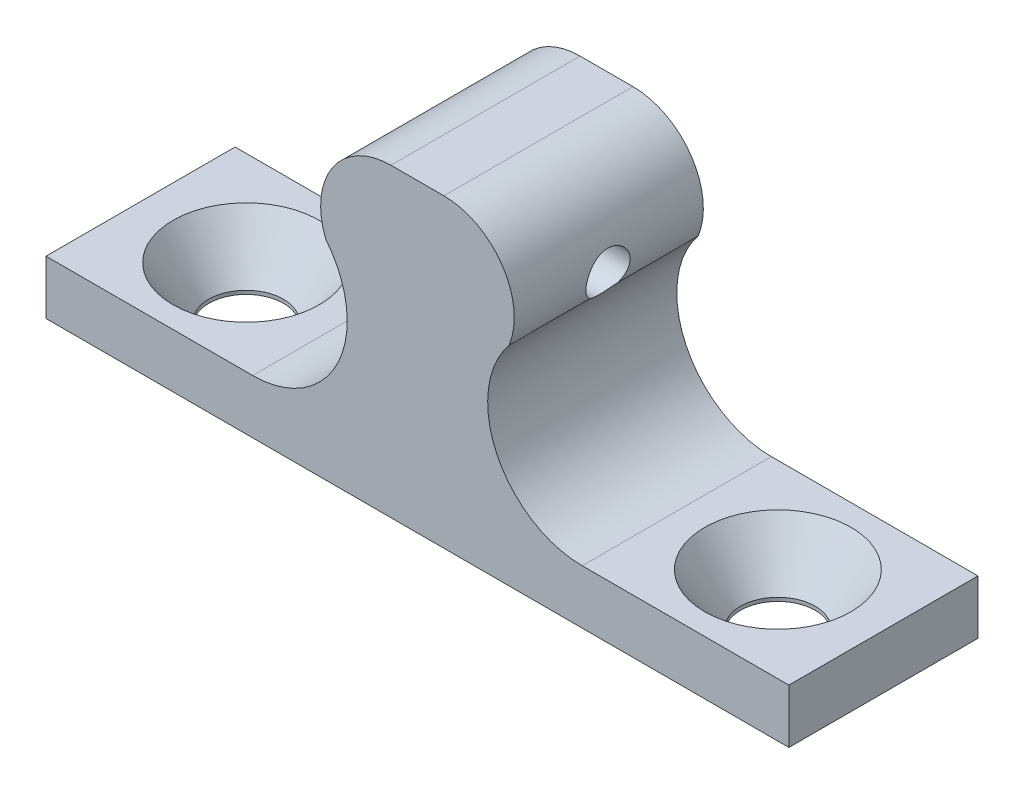
ISO-10303-21;
HEADER;
FILE_DESCRIPTION(('STEP AP214'),'2;1');
FILE_NAME('part.step','',(''),(''),'','','');
FILE_SCHEMA(('AUTOMOTIVE_DESIGN { 1 0 10303 214 1 1 1 1 }'));
ENDSEC;
DATA;
#1=APPLICATION_CONTEXT('core data for automotive mechanical design processes');
#2=APPLICATION_PROTOCOL_DEFINITION('international standard','automotive_design',2000,#1);
#3=PRODUCT_CONTEXT('',#1,'mechanical');
#4=PRODUCT('Part','Part','',(#3));
#5=PRODUCT_RELATED_PRODUCT_CATEGORY('part','',(#4));
#6=PRODUCT_DEFINITION_FORMATION('','',#4);
#7=PRODUCT_DEFINITION_CONTEXT('part definition',#1,'design');
#8=PRODUCT_DEFINITION('design','',#6,#7);
#9=PRODUCT_DEFINITION_SHAPE('','',#8);
#10=(LENGTH_UNIT() NAMED_UNIT(*) SI_UNIT(.MILLI.,.METRE.));
#11=(NAMED_UNIT(*) PLANE_ANGLE_UNIT() SI_UNIT($,.RADIAN.));
#12=(NAMED_UNIT(*) SI_UNIT($,.STERADIAN.) SOLID_ANGLE_UNIT());
#13=UNCERTAINTY_MEASURE_WITH_UNIT(LENGTH_MEASURE(1.E-05),#10,'distance_accuracy_value','');
#14=(GEOMETRIC_REPRESENTATION_CONTEXT(3) GLOBAL_UNCERTAINTY_ASSIGNED_CONTEXT((#13)) GLOBAL_UNIT_ASSIGNED_CONTEXT((#10,
#11,#12)) REPRESENTATION_CONTEXT('',''));
#15=CARTESIAN_POINT('',(0.,0.,0.));
#16=DIRECTION('',(0.,0.,1.));
#17=DIRECTION('',(1.,0.,0.));
#18=AXIS2_PLACEMENT_3D('',#15,#16,#17);
#19=CARTESIAN_POINT('',(9.76629999999998,33.782,10.8458000000001));
#20=DIRECTION('',(0.,0.,1.));
#21=DIRECTION('',(1.,0.,0.));
#22=AXIS2_PLACEMENT_3D('',#19,#20,#21);
#23=CYLINDRICAL_SURFACE('',#22,5.33400000000001);
#24=DIRECTION('',(0.,0.,1.));
#25=VECTOR('',#24,1.);
#26=CARTESIAN_POINT('',(13.8917104349483,37.1632046290072,10.8458000000001));
#27=LINE('',#26,#25);
#28=CARTESIAN_POINT('',(13.8917104349483,37.1632046290072,16.979064721974));
#29=VERTEX_POINT('',#28);
#30=CARTESIAN_POINT('',(13.8917104349483,37.1632046290072,21.5138000000001));
#31=VERTEX_POINT('',#30);
#32=EDGE_CURVE('E235',#29,#31,#27,.T.);
#33=ORIENTED_EDGE('',*,*,#32,.F.);
#34=CARTESIAN_POINT('',(13.8917104349483,37.1632046290072,16.979064721974));
#35=CARTESIAN_POINT('',(13.9064568214383,37.145213559492,16.957774407721));
#36=CARTESIAN_POINT('',(13.9205839535459,37.1277358371933,16.9356323684469));
#37=CARTESIAN_POINT('',(13.9475371552433,37.0939898890564,16.889671933047));
#38=CARTESIAN_POINT('',(13.9603624018321,37.0777224300132,16.865852492449));
#39=CARTESIAN_POINT('',(13.9968217957988,37.0309698670322,16.7918445691978));
#40=CARTESIAN_POINT('',(14.0183694212627,37.0026211972921,16.7392071767693));
#41=CARTESIAN_POINT('',(14.0553475578543,36.953213033585,16.6283492160258));
#42=CARTESIAN_POINT('',(14.070753890902,36.932182390933,16.5701076792111));
#43=CARTESIAN_POINT('',(14.0948871379776,36.8989402799695,16.4499259093959));
#44=CARTESIAN_POINT('',(14.1036262844287,36.886712662902,16.3879926759008));
#45=CARTESIAN_POINT('',(14.1138479948756,36.8723808210998,16.2668114150897));
#46=CARTESIAN_POINT('',(14.1157951418192,36.8696286494264,16.2076783451699));
#47=CARTESIAN_POINT('',(14.1136894308318,36.8725929985263,16.0897334868972));
#48=CARTESIAN_POINT('',(14.1096371835347,36.8783086574218,16.030921666458));
#49=CARTESIAN_POINT('',(14.0958873063855,36.8975031005725,15.9174964666462));
#50=CARTESIAN_POINT('',(14.0863991041572,36.9106937076175,15.8628081707088));
#51=CARTESIAN_POINT('',(14.0621519674322,36.9439033330016,15.7567344046929));
#52=CARTESIAN_POINT('',(14.0473873862583,36.9639296657664,15.7053525428825));
#53=CARTESIAN_POINT('',(14.012115055933,37.0108549897309,15.6047890204954));
#54=CARTESIAN_POINT('',(13.9913753381325,37.0380266285772,15.5558157561853));
#55=CARTESIAN_POINT('',(13.9566214838032,37.082472000563,15.486733835725));
#56=CARTESIAN_POINT('',(13.9444389033872,37.0978901684191,15.4644497129597));
#57=CARTESIAN_POINT('',(13.9189234439372,37.1297891990879,15.4213712912668));
#58=CARTESIAN_POINT('',(13.9055912174291,37.1462694577456,15.4005761593154));
#59=CARTESIAN_POINT('',(13.8917104349483,37.1632046290072,15.3805352780262));
#60=B_SPLINE_CURVE_WITH_KNOTS('',3,(#34,#35,#36,#37,#38,#39,#40,#41,#42,#43,#44,#45,#46,#47,#48,
#49,#50,#51,#52,#53,#54,#55,#56,#57,#58,#59),.UNSPECIFIED.,.F.,.F.,(4,2,2,2,2,2,2,2,2,2,2,2,4),
(0.,0.0945618901689415,0.189183191165297,0.37887138168555,0.569299162833988,0.75937671639522,
0.936166356290478,1.1129380033155,1.28331782296715,1.45388052849371,1.63225121219452,
1.72131681047189,1.81033218477205),.UNSPECIFIED.);
#61=CARTESIAN_POINT('',(13.8917104349483,37.1632046290072,15.3805352780262));
#62=VERTEX_POINT('',#61);
#63=EDGE_CURVE('E60',#29,#62,#60,.T.);
#64=ORIENTED_EDGE('',*,*,#63,.T.);
#65=CARTESIAN_POINT('',(13.8917104349483,37.1632046290072,10.8458000000001));
#66=VERTEX_POINT('',#65);
#67=EDGE_CURVE('E54',#66,#62,#27,.T.);
#68=ORIENTED_EDGE('',*,*,#67,.F.);
#69=CARTESIAN_POINT('',(9.76629999999998,33.782,10.8458000000001));
#70=DIRECTION('',(0.,0.,-1.));
#71=DIRECTION('',(-1.,0.,0.));
#72=AXIS2_PLACEMENT_3D('',#69,#70,#71);
#73=CIRCLE('',#72,5.33400000000001);
#74=CARTESIAN_POINT('',(9.76629999999998,28.448,10.8458000000001));
#75=VERTEX_POINT('',#74);
#76=EDGE_CURVE('E233',#66,#75,#73,.T.);
#77=ORIENTED_EDGE('',*,*,#76,.T.);
#78=DIRECTION('',(0.,0.,1.));
#79=VECTOR('',#78,1.);
#80=CARTESIAN_POINT('',(9.76629999999998,28.448,10.8458000000001));
#81=LINE('',#80,#79);
#82=CARTESIAN_POINT('',(9.76629999999998,28.448,21.5138000000001));
#83=VERTEX_POINT('',#82);
#84=EDGE_CURVE('E172',#75,#83,#81,.T.);
#85=ORIENTED_EDGE('',*,*,#84,.T.);
#86=CARTESIAN_POINT('',(9.76629999999998,33.782,21.5138000000001));
#87=DIRECTION('',(0.,0.,-1.));
#88=DIRECTION('',(-1.,0.,0.));
#89=AXIS2_PLACEMENT_3D('',#86,#87,#88);
#90=CIRCLE('',#89,5.33400000000001);
#91=EDGE_CURVE('E192',#31,#83,#90,.T.);
#92=ORIENTED_EDGE('',*,*,#91,.F.);
#93=EDGE_LOOP('',(#33,#64,#68,#77,#85,#92));
#94=FACE_BOUND('',#93,.T.);
#95=ADVANCED_FACE('F39',(#94),#23,.F.);
#96=CARTESIAN_POINT('',(17.57045,38.65245,10.8458000000001));
#97=DIRECTION('',(0.,0.,1.));
#98=DIRECTION('',(1.,0.,0.));
#99=AXIS2_PLACEMENT_3D('',#96,#97,#98);
#100=CYLINDRICAL_SURFACE('',#99,3.96875);
#101=ORIENTED_EDGE('',*,*,#67,.T.);
#102=CARTESIAN_POINT('',(13.8917104349483,37.1632046290072,15.3805352780262));
#103=CARTESIAN_POINT('',(13.8729359312902,37.2095011038292,15.3257255619573));
#104=CARTESIAN_POINT('',(13.8533621773395,37.2604363913203,15.2751333478826));
#105=CARTESIAN_POINT('',(13.8140665613535,37.3703033009326,15.1834008850535));
#106=CARTESIAN_POINT('',(13.7943445168311,37.4292471901211,15.1422754024116));
#107=CARTESIAN_POINT('',(13.756255681064,37.5537451487884,15.0706429041042));
#108=CARTESIAN_POINT('',(13.7378899259765,37.6193041833529,15.0401439419253));
#109=CARTESIAN_POINT('',(13.7037990422014,37.7552964189653,14.9908925533663));
#110=CARTESIAN_POINT('',(13.6880715138912,37.8257251075128,14.9721294097067));
#111=CARTESIAN_POINT('',(13.6606377971039,37.9673298912527,14.9475926346924));
#112=CARTESIAN_POINT('',(13.6488252789123,38.0384204297791,14.941446804895));
#113=CARTESIAN_POINT('',(13.6291261789329,38.1811471439731,14.94153782779));
#114=CARTESIAN_POINT('',(13.621238933162,38.2527832252758,14.9477725853419));
#115=CARTESIAN_POINT('',(13.6098177015628,38.3900742929749,14.9719119990443));
#116=CARTESIAN_POINT('',(13.6060569319082,38.4558346342304,14.9891158429061));
#117=CARTESIAN_POINT('',(13.6017788275708,38.5837391385869,15.0340904713748));
#118=CARTESIAN_POINT('',(13.60126112878,38.6458837068639,15.0618600693656));
#119=CARTESIAN_POINT('',(13.6028338174344,38.7640502594775,15.126782804235));
#120=CARTESIAN_POINT('',(13.6048934059945,38.8201360085947,15.1638209791515));
#121=CARTESIAN_POINT('',(13.6107541590806,38.9255361498099,15.2464158961392));
#122=CARTESIAN_POINT('',(13.6145555985688,38.9748494712397,15.2919739824595));
#123=CARTESIAN_POINT('',(13.6230978817274,39.0666660541235,15.3917302503087));
#124=CARTESIAN_POINT('',(13.6278612015107,39.1089509960119,15.4461275210853));
#125=CARTESIAN_POINT('',(13.6372669943105,39.1839392576801,15.5611813973611));
#126=CARTESIAN_POINT('',(13.6419094569338,39.2166417558788,15.6218385389678));
#127=CARTESIAN_POINT('',(13.6502547325184,39.2720034750186,15.7487952035791));
#128=CARTESIAN_POINT('',(13.6539415165141,39.2944956081467,15.8151688145115));
#129=CARTESIAN_POINT('',(13.6595779071545,39.3279853477881,15.9508241095255));
#130=CARTESIAN_POINT('',(13.6615276987527,39.3389841781195,16.0201054831683));
#131=CARTESIAN_POINT('',(13.6633147359991,39.3490826159216,16.1587290116086));
#132=CARTESIAN_POINT('',(13.6631767859565,39.3483219349741,16.2280606808372));
#133=CARTESIAN_POINT('',(13.6608743733507,39.3352660164189,16.36559272376));
#134=CARTESIAN_POINT('',(13.6587099317442,39.322970898092,16.4337931091458));
#135=CARTESIAN_POINT('',(13.6527696461972,39.2873340819557,16.566723182177));
#136=CARTESIAN_POINT('',(13.6490035455908,39.2640590857385,16.6314712339354));
#137=CARTESIAN_POINT('',(13.6405517616937,39.2071568101485,16.7561847172069));
#138=CARTESIAN_POINT('',(13.6358659700871,39.1735283111341,16.8161495842127));
#139=CARTESIAN_POINT('',(13.6264022289107,39.0962900044778,16.9304978687083));
#140=CARTESIAN_POINT('',(13.6216239080122,39.0525469415786,16.9847913059371));
#141=CARTESIAN_POINT('',(13.6130734873739,38.956531037619,17.0853256604983));
#142=CARTESIAN_POINT('',(13.609301395069,38.9042581335373,17.1315665183305));
#143=CARTESIAN_POINT('',(13.6037823006781,38.7926047394093,17.2146783656449));
#144=CARTESIAN_POINT('',(13.6020357421573,38.7332226956946,17.2515473014198));
#145=CARTESIAN_POINT('',(13.6014524652234,38.609097762435,17.3147825605264));
#146=CARTESIAN_POINT('',(13.6026150638656,38.5443561345393,17.3411513471557));
#147=CARTESIAN_POINT('',(13.6083829628536,38.4133201707711,17.3820459449305));
#148=CARTESIAN_POINT('',(13.6128936752951,38.3471160919264,17.3968746324603));
#149=CARTESIAN_POINT('',(13.6254767848479,38.2135170724605,17.4155333992383));
#150=CARTESIAN_POINT('',(13.6335487872033,38.1461222646219,17.4193646971538));
#151=CARTESIAN_POINT('',(13.6529961727364,38.0129096220909,17.4161477870481));
#152=CARTESIAN_POINT('',(13.6643311238972,37.9470825650347,17.409228436884));
#153=CARTESIAN_POINT('',(13.6898793526002,37.8178912948272,17.3851902448271));
#154=CARTESIAN_POINT('',(13.7040935764277,37.7545278995507,17.3680680461224));
#155=CARTESIAN_POINT('',(13.7352680716703,37.629377705242,17.323446332289));
#156=CARTESIAN_POINT('',(13.7523132967574,37.5677467016338,17.2955710230138));
#157=CARTESIAN_POINT('',(13.7877070157234,37.4501171756218,17.2304000087498));
#158=CARTESIAN_POINT('',(13.8060550410309,37.3941166454687,17.1931076785178));
#159=CARTESIAN_POINT('',(13.8358327632935,37.3090207854415,17.125904556147));
#160=CARTESIAN_POINT('',(13.847230561711,37.2778134150343,17.0986077803833));
#161=CARTESIAN_POINT('',(13.8697473005918,37.2182992412179,17.0410301714885));
#162=CARTESIAN_POINT('',(13.8808667323948,37.1899870080119,17.0107551414431));
#163=CARTESIAN_POINT('',(13.8917104349483,37.1632046290072,16.979064721974));
#164=B_SPLINE_CURVE_WITH_KNOTS('',3,(#102,#103,#104,#105,#106,#107,#108,#109,#110,#111,#112,
#113,#114,#115,#116,#117,#118,#119,#120,#121,#122,#123,#124,#125,#126,#127,#128,#129,#130,#131,
#132,#133,#134,#135,#136,#137,#138,#139,#140,#141,#142,#143,#144,#145,#146,#147,#148,#149,#150,
#151,#152,#153,#154,#155,#156,#157,#158,#159,#160,#161,#162,#163),.UNSPECIFIED.,.F.,.F.,(4,2,2,
2,2,2,2,2,2,2,2,2,2,2,2,2,2,2,2,2,2,2,2,2,2,2,2,2,2,2,4),(0.,0.222203533295454,0.44475134374622,
0.667467450782713,0.889979872904233,1.10582817670276,1.32163995606481,1.52488268791103,
1.72810260075694,1.92891703821238,2.12976318641361,2.33600032023718,2.54225513128549,
2.75177324038397,2.96126903751754,3.16827780438948,3.37528443055198,3.58104939622043,
3.78683861026406,3.99551133482385,4.20418560119492,4.41290555586199,4.62157651668589,
4.82456649205031,5.02753397236814,5.22808737597508,5.42870679957884,5.63708655467834,
5.84539173890959,5.97420414821798,6.10277036088128),.UNSPECIFIED.);
#165=EDGE_CURVE('E143',#62,#29,#164,.T.);
#166=ORIENTED_EDGE('',*,*,#165,.T.);
#167=ORIENTED_EDGE('',*,*,#32,.T.);
#168=CARTESIAN_POINT('',(17.57045,38.65245,21.5138000000001));
#169=DIRECTION('',(0.,0.,1.));
#170=DIRECTION('',(1.,0.,0.));
#171=AXIS2_PLACEMENT_3D('',#168,#169,#170);
#172=CIRCLE('',#171,3.96875);
#173=CARTESIAN_POINT('',(17.57045,42.6212,21.5138000000001));
#174=VERTEX_POINT('',#173);
#175=EDGE_CURVE('E229',#174,#31,#172,.T.);
#176=ORIENTED_EDGE('',*,*,#175,.F.);
#177=DIRECTION('',(0.,0.,1.));
#178=VECTOR('',#177,1.);
#179=CARTESIAN_POINT('',(17.57045,42.6212,10.8458000000001));
#180=LINE('',#179,#178);
#181=CARTESIAN_POINT('',(17.57045,42.6212,10.8458000000001));
#182=VERTEX_POINT('',#181);
#183=EDGE_CURVE('E154',#182,#174,#180,.T.);
#184=ORIENTED_EDGE('',*,*,#183,.F.);
#185=CARTESIAN_POINT('',(17.57045,38.65245,10.8458000000001));
#186=DIRECTION('',(0.,0.,1.));
#187=DIRECTION('',(1.,0.,0.));
#188=AXIS2_PLACEMENT_3D('',#185,#186,#187);
#189=CIRCLE('',#188,3.96875);
#190=EDGE_CURVE('E174',#182,#66,#189,.T.);
#191=ORIENTED_EDGE('',*,*,#190,.T.);
#192=EDGE_LOOP('',(#101,#166,#167,#176,#184,#191));
#193=FACE_BOUND('',#192,.T.);
#194=ADVANCED_FACE('F242',(#193),#100,.T.);
#195=CARTESIAN_POINT('',(20.55495,38.65245,10.8458000000001));
#196=DIRECTION('',(0.,0.,1.));
#197=DIRECTION('',(1.,0.,0.));
#198=AXIS2_PLACEMENT_3D('',#195,#196,#197);
#199=CYLINDRICAL_SURFACE('',#198,3.96875);
#200=DIRECTION('',(0.,0.,1.));
#201=VECTOR('',#200,1.);
#202=CARTESIAN_POINT('',(24.2336895650516,37.1632046290072,10.8458000000001));
#203=LINE('',#202,#201);
#204=CARTESIAN_POINT('',(24.2336895650516,37.1632046290072,16.979064721974));
#205=VERTEX_POINT('',#204);
#206=CARTESIAN_POINT('',(24.2336895650516,37.1632046290072,21.5138000000001));
#207=VERTEX_POINT('',#206);
#208=EDGE_CURVE('E141',#205,#207,#203,.T.);
#209=ORIENTED_EDGE('',*,*,#208,.F.);
#210=CARTESIAN_POINT('',(24.2336895650516,37.1632046290072,16.9790647219739));
#211=CARTESIAN_POINT('',(24.2524640687097,37.2095011038292,17.0338744380429));
#212=CARTESIAN_POINT('',(24.2720378226605,37.2604363913202,17.0844666521175));
#213=CARTESIAN_POINT('',(24.3113334386464,37.3703033009325,17.1761991149466));
#214=CARTESIAN_POINT('',(24.3310554831688,37.429247190121,17.2173245975885));
#215=CARTESIAN_POINT('',(24.3691443189359,37.5537451487883,17.2889570958959));
#216=CARTESIAN_POINT('',(24.3875100740234,37.6193041833528,17.3194560580748));
#217=CARTESIAN_POINT('',(24.4216009577985,37.7552964189652,17.3687074466338));
#218=CARTESIAN_POINT('',(24.4373284861087,37.8257251075127,17.3874705902934));
#219=CARTESIAN_POINT('',(24.464762202896,37.9673298912525,17.4120073653078));
#220=CARTESIAN_POINT('',(24.4765747210876,38.038420429779,17.4181531951051));
#221=CARTESIAN_POINT('',(24.496273821067,38.1811471439728,17.4180621722102));
#222=CARTESIAN_POINT('',(24.5041610668379,38.2527832252756,17.4118274146583));
#223=CARTESIAN_POINT('',(24.5155822984371,38.3900742929746,17.3876880009559));
#224=CARTESIAN_POINT('',(24.5193430680917,38.4558346342301,17.3704841570942));
#225=CARTESIAN_POINT('',(24.5236211724291,38.5837391385865,17.3255095286255));
#226=CARTESIAN_POINT('',(24.5241388712199,38.6458837068635,17.2977399306347));
#227=CARTESIAN_POINT('',(24.5225661825655,38.7640502594771,17.2328171957654));
#228=CARTESIAN_POINT('',(24.5205065940055,38.8201360085943,17.1957790208489));
#229=CARTESIAN_POINT('',(24.5146458409193,38.9255361498095,17.1131841038614));
#230=CARTESIAN_POINT('',(24.5108444014312,38.9748494712393,17.067626017541));
#231=CARTESIAN_POINT('',(24.5023021182726,39.0666660541231,16.9678697496919));
#232=CARTESIAN_POINT('',(24.4975387984893,39.1089509960115,16.9134724789154));
#233=CARTESIAN_POINT('',(24.4881330056895,39.1839392576798,16.7984186026396));
#234=CARTESIAN_POINT('',(24.4834905430662,39.2166417558784,16.737761461033));
#235=CARTESIAN_POINT('',(24.4751452674816,39.2720034750184,16.6108047964217));
#236=CARTESIAN_POINT('',(24.4714584834859,39.2944956081465,16.5444311854893));
#237=CARTESIAN_POINT('',(24.4658220928454,39.327985347788,16.4087758904754));
#238=CARTESIAN_POINT('',(24.4638723012472,39.3389841781194,16.3394945168325));
#239=CARTESIAN_POINT('',(24.4620852640008,39.3490826159216,16.2008709883922));
#240=CARTESIAN_POINT('',(24.4622232140435,39.3483219349742,16.1315393191636));
#241=CARTESIAN_POINT('',(24.4645256266492,39.335266016419,15.9940072762407));
#242=CARTESIAN_POINT('',(24.4666900682557,39.3229708980921,15.925806890855));
#243=CARTESIAN_POINT('',(24.4726303538027,39.2873340819558,15.7928768178237));
#244=CARTESIAN_POINT('',(24.4763964544091,39.2640590857387,15.7281287660653));
#245=CARTESIAN_POINT('',(24.4848482383062,39.2071568101488,15.6034152827938));
#246=CARTESIAN_POINT('',(24.4895340299128,39.1735283111343,15.5434504157879));
#247=CARTESIAN_POINT('',(24.4989977710892,39.0962900044781,15.4291021312923));
#248=CARTESIAN_POINT('',(24.5037760919877,39.0525469415789,15.3748086940635));
#249=CARTESIAN_POINT('',(24.512326512626,38.9565310376193,15.2742743395021));
#250=CARTESIAN_POINT('',(24.5160986049309,38.9042581335376,15.2280334816699));
#251=CARTESIAN_POINT('',(24.5216176993218,38.7926047394096,15.1449216343555));
#252=CARTESIAN_POINT('',(24.5233642578426,38.733222695695,15.1080526985806));
#253=CARTESIAN_POINT('',(24.5239475347765,38.6090977624355,15.0448174394739));
#254=CARTESIAN_POINT('',(24.5227849361343,38.5443561345398,15.0184486528447));
#255=CARTESIAN_POINT('',(24.5170170371464,38.4133201707716,14.9775540550698));
#256=CARTESIAN_POINT('',(24.5125063247049,38.3471160919269,14.96272536754));
#257=CARTESIAN_POINT('',(24.4999232151521,38.2135170724611,14.9440666007619));
#258=CARTESIAN_POINT('',(24.4918512127967,38.1461222646225,14.9402353028464));
#259=CARTESIAN_POINT('',(24.4724038272637,38.0129096220916,14.943452212952));
#260=CARTESIAN_POINT('',(24.4610688761029,37.9470825650354,14.950371563116));
#261=CARTESIAN_POINT('',(24.4355206473999,37.817891294828,14.9744097551729));
#262=CARTESIAN_POINT('',(24.4213064235724,37.7545278995515,14.9915319538776));
#263=CARTESIAN_POINT('',(24.3901319283299,37.6293777052428,15.0361536677109));
#264=CARTESIAN_POINT('',(24.3730867032427,37.5677467016346,15.064028976986));
#265=CARTESIAN_POINT('',(24.3376929842768,37.4501171756226,15.1291999912498));
#266=CARTESIAN_POINT('',(24.3193449589692,37.3941166454695,15.1664923214819));
#267=CARTESIAN_POINT('',(24.2895672367066,37.3090207854421,15.2336954438526));
#268=CARTESIAN_POINT('',(24.2781694382891,37.2778134150348,15.2609922196164));
#269=CARTESIAN_POINT('',(24.2556526994082,37.2182992412181,15.3185698285114));
#270=CARTESIAN_POINT('',(24.2445332676052,37.189987008012,15.348844858557));
#271=CARTESIAN_POINT('',(24.2336895650516,37.1632046290072,15.3805352780262));
#272=B_SPLINE_CURVE_WITH_KNOTS('',3,(#210,#211,#212,#213,#214,#215,#216,#217,#218,#219,#220,
#221,#222,#223,#224,#225,#226,#227,#228,#229,#230,#231,#232,#233,#234,#235,#236,#237,#238,#239,
#240,#241,#242,#243,#244,#245,#246,#247,#248,#249,#250,#251,#252,#253,#254,#255,#256,#257,#258,
#259,#260,#261,#262,#263,#264,#265,#266,#267,#268,#269,#270,#271),.UNSPECIFIED.,.F.,.F.,(4,2,2,
2,2,2,2,2,2,2,2,2,2,2,2,2,2,2,2,2,2,2,2,2,2,2,2,2,2,2,4),(0.,0.222203533295425,
0.444751343746174,0.667467450782644,0.889979872904142,1.1058281767026,1.32163995606459,
1.52488268791072,1.72810260075657,1.92891703821193,2.12976318641307,2.33600032023657,
2.54225513128483,2.75177324038331,2.96126903751688,3.16827780438888,3.37528443055142,
3.58104939621992,3.78683861026361,3.99551133482342,4.20418560119451,4.41290555586157,
4.62157651668542,4.82456649204979,5.02753397236756,5.2280873759744,5.42870679957807,
5.63708655467748,5.84539173890861,5.97420414821754,6.10277036088137),.UNSPECIFIED.);
#273=CARTESIAN_POINT('',(24.2336895650516,37.1632046290072,15.3805352780262));
#274=VERTEX_POINT('',#273);
#275=EDGE_CURVE('E67',#205,#274,#272,.T.);
#276=ORIENTED_EDGE('',*,*,#275,.T.);
#277=CARTESIAN_POINT('',(24.2336895650516,37.1632046290072,10.8458000000001));
#278=VERTEX_POINT('',#277);
#279=EDGE_CURVE('E138',#278,#274,#203,.T.);
#280=ORIENTED_EDGE('',*,*,#279,.F.);
#281=CARTESIAN_POINT('',(20.55495,38.65245,10.8458000000001));
#282=DIRECTION('',(0.,0.,1.));
#283=DIRECTION('',(1.,0.,0.));
#284=AXIS2_PLACEMENT_3D('',#281,#282,#283);
#285=CIRCLE('',#284,3.96875);
#286=CARTESIAN_POINT('',(20.55495,42.6212,10.8458000000001));
#287=VERTEX_POINT('',#286);
#288=EDGE_CURVE('E188',#278,#287,#285,.T.);
#289=ORIENTED_EDGE('',*,*,#288,.T.);
#290=DIRECTION('',(0.,0.,1.));
#291=VECTOR('',#290,1.);
#292=CARTESIAN_POINT('',(20.55495,42.6212,10.8458000000001));
#293=LINE('',#292,#291);
#294=CARTESIAN_POINT('',(20.55495,42.6212,21.5138000000001));
#295=VERTEX_POINT('',#294);
#296=EDGE_CURVE('E150',#287,#295,#293,.T.);
#297=ORIENTED_EDGE('',*,*,#296,.T.);
#298=CARTESIAN_POINT('',(20.55495,38.65245,21.5138000000001));
#299=DIRECTION('',(0.,0.,1.));
#300=DIRECTION('',(1.,0.,0.));
#301=AXIS2_PLACEMENT_3D('',#298,#299,#300);
#302=CIRCLE('',#301,3.96875);
#303=EDGE_CURVE('E221',#207,#295,#302,.T.);
#304=ORIENTED_EDGE('',*,*,#303,.F.);
#305=EDGE_LOOP('',(#209,#276,#280,#289,#297,#304));
#306=FACE_BOUND('',#305,.T.);
#307=ADVANCED_FACE('F136',(#306),#199,.T.);
#308=CARTESIAN_POINT('',(28.3591,33.782,10.8458000000001));
#309=DIRECTION('',(0.,0.,1.));
#310=DIRECTION('',(1.,0.,0.));
#311=AXIS2_PLACEMENT_3D('',#308,#309,#310);
#312=CYLINDRICAL_SURFACE('',#311,5.33400000000001);
#313=ORIENTED_EDGE('',*,*,#279,.T.);
#314=CARTESIAN_POINT('',(24.2336895650516,37.1632046290072,15.3805352780262));
#315=CARTESIAN_POINT('',(24.2189431785616,37.145213559492,15.4018255922792));
#316=CARTESIAN_POINT('',(24.204816046454,37.1277358371932,15.4239676315534));
#317=CARTESIAN_POINT('',(24.1778628447566,37.0939898890563,15.4699280669533));
#318=CARTESIAN_POINT('',(24.1650375981678,37.077722430013,15.4937475075513));
#319=CARTESIAN_POINT('',(24.128578204201,37.030969867032,15.5677554308026));
#320=CARTESIAN_POINT('',(24.1070305787371,37.0026211972919,15.6203928232311));
#321=CARTESIAN_POINT('',(24.0700524421455,36.9532130335849,15.7312507839748));
#322=CARTESIAN_POINT('',(24.0546461090978,36.9321823909329,15.7894923207895));
#323=CARTESIAN_POINT('',(24.0305128620222,36.8989402799694,15.9096740906049));
#324=CARTESIAN_POINT('',(24.0217737155712,36.8867126629019,15.9716073241001));
#325=CARTESIAN_POINT('',(24.0115520051242,36.8723808210997,16.0927885849113));
#326=CARTESIAN_POINT('',(24.0096048581807,36.8696286494264,16.1519216548311));
#327=CARTESIAN_POINT('',(24.0117105691682,36.8725929985264,16.269866513104));
#328=CARTESIAN_POINT('',(24.0157628164653,36.8783086574219,16.3286783335432));
#329=CARTESIAN_POINT('',(24.0295126936146,36.8975031005727,16.4421035333551));
#330=CARTESIAN_POINT('',(24.039000895843,36.9106937076178,16.4967918292925));
#331=CARTESIAN_POINT('',(24.0632480325681,36.943903333002,16.6028655953084));
#332=CARTESIAN_POINT('',(24.078012613742,36.9639296657669,16.6542474571189));
#333=CARTESIAN_POINT('',(24.1132849440673,37.0108549897314,16.7548109795058));
#334=CARTESIAN_POINT('',(24.1340246618678,37.0380266285776,16.8037842438156));
#335=CARTESIAN_POINT('',(24.1687785161969,37.0824720005633,16.8728661642756));
#336=CARTESIAN_POINT('',(24.1809610966129,37.0978901684193,16.8951502870408));
#337=CARTESIAN_POINT('',(24.2064765560628,37.129789199088,16.9382287087335));
#338=CARTESIAN_POINT('',(24.2198087825709,37.1462694577456,16.9590238406848));
#339=CARTESIAN_POINT('',(24.2336895650516,37.1632046290072,16.979064721974));
#340=B_SPLINE_CURVE_WITH_KNOTS('',3,(#314,#315,#316,#317,#318,#319,#320,#321,#322,#323,#324,
#325,#326,#327,#328,#329,#330,#331,#332,#333,#334,#335,#336,#337,#338,#339),.UNSPECIFIED.,.F.,
.F.,(4,2,2,2,2,2,2,2,2,2,2,2,4),(0.,0.0945618901690322,0.189183191165479,0.378871381685907,
0.569299162834527,0.759376716395948,0.936166356291367,1.11293800331655,1.28331782296838,
1.45388052849512,1.63225121219518,1.72131681047216,1.81033218477195),.UNSPECIFIED.);
#341=EDGE_CURVE('E11',#274,#205,#340,.T.);
#342=ORIENTED_EDGE('',*,*,#341,.T.);
#343=ORIENTED_EDGE('',*,*,#208,.T.);
#344=CARTESIAN_POINT('',(28.3591,33.782,21.5138000000001));
#345=DIRECTION('',(0.,0.,-1.));
#346=DIRECTION('',(-1.,0.,0.));
#347=AXIS2_PLACEMENT_3D('',#344,#345,#346);
#348=CIRCLE('',#347,5.33400000000001);
#349=CARTESIAN_POINT('',(28.3591,28.448,21.5138000000001));
#350=VERTEX_POINT('',#349);
#351=EDGE_CURVE('E217',#350,#207,#348,.T.);
#352=ORIENTED_EDGE('',*,*,#351,.F.);
#353=DIRECTION('',(0.,0.,1.));
#354=VECTOR('',#353,1.);
#355=CARTESIAN_POINT('',(28.3591,28.448,10.8458000000001));
#356=LINE('',#355,#354);
#357=CARTESIAN_POINT('',(28.3591,28.448,10.8458000000001));
#358=VERTEX_POINT('',#357);
#359=EDGE_CURVE('E156',#358,#350,#356,.T.);
#360=ORIENTED_EDGE('',*,*,#359,.F.);
#361=CARTESIAN_POINT('',(28.3591,33.782,10.8458000000001));
#362=DIRECTION('',(0.,0.,-1.));
#363=DIRECTION('',(-1.,0.,0.));
#364=AXIS2_PLACEMENT_3D('',#361,#362,#363);
#365=CIRCLE('',#364,5.33400000000001);
#366=EDGE_CURVE('E148',#358,#278,#365,.T.);
#367=ORIENTED_EDGE('',*,*,#366,.T.);
#368=EDGE_LOOP('',(#313,#342,#343,#352,#360,#367));
#369=FACE_BOUND('',#368,.T.);
#370=ADVANCED_FACE('F146',(#369),#312,.F.);
#371=CARTESIAN_POINT('',(20.55495,42.6212,10.8458000000001));
#372=DIRECTION('',(0.,1.,0.));
#373=DIRECTION('',(0.,0.,1.));
#374=AXIS2_PLACEMENT_3D('',#371,#372,#373);
#375=PLANE('',#374);
#376=DIRECTION('',(-1.,0.,0.));
#377=VECTOR('',#376,1.);
#378=CARTESIAN_POINT('',(20.55495,42.6212,21.5138000000001));
#379=LINE('',#378,#377);
#380=EDGE_CURVE('E225',#295,#174,#379,.T.);
#381=ORIENTED_EDGE('',*,*,#380,.F.);
#382=ORIENTED_EDGE('',*,*,#296,.F.);
#383=DIRECTION('',(-1.,0.,0.));
#384=VECTOR('',#383,1.);
#385=CARTESIAN_POINT('',(20.55495,42.6212,10.8458000000001));
#386=LINE('',#385,#384);
#387=EDGE_CURVE('E181',#287,#182,#386,.T.);
#388=ORIENTED_EDGE('',*,*,#387,.T.);
#389=ORIENTED_EDGE('',*,*,#183,.T.);
#390=EDGE_LOOP('',(#381,#382,#388,#389));
#391=FACE_BOUND('',#390,.T.);
#392=ADVANCED_FACE('F245',(#391),#375,.T.);
#393=CARTESIAN_POINT('',(40.0176999999999,28.448,10.8458000000001));
#394=DIRECTION('',(0.,1.,0.));
#395=DIRECTION('',(0.,0.,1.));
#396=AXIS2_PLACEMENT_3D('',#393,#394,#395);
#397=PLANE('',#396);
#398=CARTESIAN_POINT('',(34.0614,28.448,16.1798000000001));
#399=DIRECTION('',(0.,1.,0.));
#400=DIRECTION('',(0.,0.,1.));
#401=AXIS2_PLACEMENT_3D('',#398,#399,#400);
#402=CIRCLE('',#401,4.12750000004672);
#403=CARTESIAN_POINT('',(34.0614,28.448,20.3073000000468));
#404=VERTEX_POINT('',#403);
#405=EDGE_CURVE('E295',#404,#404,#402,.T.);
#406=ORIENTED_EDGE('',*,*,#405,.F.);
#407=EDGE_LOOP('',(#406));
#408=FACE_BOUND('',#407,.T.);
#409=DIRECTION('',(-1.,0.,0.));
#410=VECTOR('',#409,1.);
#411=CARTESIAN_POINT('',(40.0176999999999,28.448,21.5138000000001));
#412=LINE('',#411,#410);
#413=CARTESIAN_POINT('',(40.0176999999999,28.448,21.5138000000001));
#414=VERTEX_POINT('',#413);
#415=EDGE_CURVE('E213',#414,#350,#412,.T.);
#416=ORIENTED_EDGE('',*,*,#415,.F.);
#417=DIRECTION('',(0.,0.,1.));
#418=VECTOR('',#417,1.);
#419=CARTESIAN_POINT('',(40.0176999999999,28.448,10.8458000000001));
#420=LINE('',#419,#418);
#421=CARTESIAN_POINT('',(40.0176999999999,28.448,10.8458000000001));
#422=VERTEX_POINT('',#421);
#423=EDGE_CURVE('E161',#422,#414,#420,.T.);
#424=ORIENTED_EDGE('',*,*,#423,.F.);
#425=DIRECTION('',(-1.,0.,0.));
#426=VECTOR('',#425,1.);
#427=CARTESIAN_POINT('',(40.0176999999999,28.448,10.8458000000001));
#428=LINE('',#427,#426);
#429=EDGE_CURVE('E252',#422,#358,#428,.T.);
#430=ORIENTED_EDGE('',*,*,#429,.T.);
#431=ORIENTED_EDGE('',*,*,#359,.T.);
#432=EDGE_LOOP('',(#416,#424,#430,#431));
#433=FACE_BOUND('',#432,.T.);
#434=ADVANCED_FACE('F329',(#408,#433),#397,.T.);
#435=CARTESIAN_POINT('',(40.0176999999999,25.4000000000001,10.8458000000001));
#436=DIRECTION('',(1.,0.,0.));
#437=DIRECTION('',(0.,0.,-1.));
#438=AXIS2_PLACEMENT_3D('',#435,#436,#437);
#439=PLANE('',#438);
#440=DIRECTION('',(0.,1.,0.));
#441=VECTOR('',#440,1.);
#442=CARTESIAN_POINT('',(40.0176999999999,25.4000000000001,21.5138000000001));
#443=LINE('',#442,#441);
#444=CARTESIAN_POINT('',(40.0176999999999,25.4000000000001,21.5138000000001));
#445=VERTEX_POINT('',#444);
#446=EDGE_CURVE('E209',#445,#414,#443,.T.);
#447=ORIENTED_EDGE('',*,*,#446,.F.);
#448=DIRECTION('',(0.,0.,1.));
#449=VECTOR('',#448,1.);
#450=CARTESIAN_POINT('',(40.0176999999999,25.4000000000001,10.8458000000001));
#451=LINE('',#450,#449);
#452=CARTESIAN_POINT('',(40.0176999999999,25.4000000000001,10.8458000000001));
#453=VERTEX_POINT('',#452);
#454=EDGE_CURVE('E164',#453,#445,#451,.T.);
#455=ORIENTED_EDGE('',*,*,#454,.F.);
#456=DIRECTION('',(0.,1.,0.));
#457=VECTOR('',#456,1.);
#458=CARTESIAN_POINT('',(40.0176999999999,25.4000000000001,10.8458000000001));
#459=LINE('',#458,#457);
#460=EDGE_CURVE('E258',#453,#422,#459,.T.);
#461=ORIENTED_EDGE('',*,*,#460,.T.);
#462=ORIENTED_EDGE('',*,*,#423,.T.);
#463=EDGE_LOOP('',(#447,#455,#461,#462));
#464=FACE_BOUND('',#463,.T.);
#465=ADVANCED_FACE('F332',(#464),#439,.T.);
#466=CARTESIAN_POINT('',(-1.89230000000001,25.4000000000001,10.8458000000001));
#467=DIRECTION('',(0.,-1.,0.));
#468=DIRECTION('',(0.,0.,-1.));
#469=AXIS2_PLACEMENT_3D('',#466,#467,#468);
#470=PLANE('',#469);
#471=CARTESIAN_POINT('',(34.0614,25.4000000000001,16.1798000000001));
#472=DIRECTION('',(0.,1.,0.));
#473=DIRECTION('',(0.,0.,1.));
#474=AXIS2_PLACEMENT_3D('',#471,#472,#473);
#475=CIRCLE('',#474,2.10819999999999);
#476=CARTESIAN_POINT('',(34.0614,25.4000000000001,18.2880000000001));
#477=VERTEX_POINT('',#476);
#478=EDGE_CURVE('E287',#477,#477,#475,.T.);
#479=ORIENTED_EDGE('',*,*,#478,.T.);
#480=EDGE_LOOP('',(#479));
#481=FACE_BOUND('',#480,.T.);
#482=CARTESIAN_POINT('',(4.064,25.4000000000001,16.1798000000001));
#483=DIRECTION('',(0.,1.,0.));
#484=DIRECTION('',(0.,0.,1.));
#485=AXIS2_PLACEMENT_3D('',#482,#483,#484);
#486=CIRCLE('',#485,2.10819999999999);
#487=CARTESIAN_POINT('',(4.064,25.4000000000001,18.2880000000001));
#488=VERTEX_POINT('',#487);
#489=EDGE_CURVE('E197',#488,#488,#486,.T.);
#490=ORIENTED_EDGE('',*,*,#489,.T.);
#491=EDGE_LOOP('',(#490));
#492=FACE_BOUND('',#491,.T.);
#493=DIRECTION('',(1.,0.,0.));
#494=VECTOR('',#493,1.);
#495=CARTESIAN_POINT('',(-1.89230000000001,25.4000000000001,21.5138000000001));
#496=LINE('',#495,#494);
#497=CARTESIAN_POINT('',(-1.89230000000001,25.4000000000001,21.5138000000001));
#498=VERTEX_POINT('',#497);
#499=EDGE_CURVE('E205',#498,#445,#496,.T.);
#500=ORIENTED_EDGE('',*,*,#499,.F.);
#501=DIRECTION('',(0.,0.,1.));
#502=VECTOR('',#501,1.);
#503=CARTESIAN_POINT('',(-1.89230000000001,25.4000000000001,10.8458000000001));
#504=LINE('',#503,#502);
#505=CARTESIAN_POINT('',(-1.89230000000001,25.4000000000001,10.8458000000001));
#506=VERTEX_POINT('',#505);
#507=EDGE_CURVE('E167',#506,#498,#504,.T.);
#508=ORIENTED_EDGE('',*,*,#507,.F.);
#509=DIRECTION('',(1.,0.,0.));
#510=VECTOR('',#509,1.);
#511=CARTESIAN_POINT('',(-1.89230000000001,25.4000000000001,10.8458000000001));
#512=LINE('',#511,#510);
#513=EDGE_CURVE('E262',#506,#453,#512,.T.);
#514=ORIENTED_EDGE('',*,*,#513,.T.);
#515=ORIENTED_EDGE('',*,*,#454,.T.);
#516=EDGE_LOOP('',(#500,#508,#514,#515));
#517=FACE_BOUND('',#516,.T.);
#518=ADVANCED_FACE('F336',(#481,#492,#517),#470,.T.);
#519=CARTESIAN_POINT('',(-1.89230000000002,28.448,10.8458000000001));
#520=DIRECTION('',(-1.,0.,0.));
#521=DIRECTION('',(0.,-1.,0.));
#522=AXIS2_PLACEMENT_3D('',#519,#520,#521);
#523=PLANE('',#522);
#524=DIRECTION('',(0.,-1.,0.));
#525=VECTOR('',#524,1.);
#526=CARTESIAN_POINT('',(-1.89230000000002,28.448,21.5138000000001));
#527=LINE('',#526,#525);
#528=CARTESIAN_POINT('',(-1.89230000000002,28.448,21.5138000000001));
#529=VERTEX_POINT('',#528);
#530=EDGE_CURVE('E201',#529,#498,#527,.T.);
#531=ORIENTED_EDGE('',*,*,#530,.F.);
#532=DIRECTION('',(0.,0.,1.));
#533=VECTOR('',#532,1.);
#534=CARTESIAN_POINT('',(-1.89230000000002,28.448,10.8458000000001));
#535=LINE('',#534,#533);
#536=CARTESIAN_POINT('',(-1.89230000000002,28.448,10.8458000000001));
#537=VERTEX_POINT('',#536);
#538=EDGE_CURVE('E170',#537,#529,#535,.T.);
#539=ORIENTED_EDGE('',*,*,#538,.F.);
#540=DIRECTION('',(0.,-1.,0.));
#541=VECTOR('',#540,1.);
#542=CARTESIAN_POINT('',(-1.89230000000002,28.448,10.8458000000001));
#543=LINE('',#542,#541);
#544=EDGE_CURVE('E266',#537,#506,#543,.T.);
#545=ORIENTED_EDGE('',*,*,#544,.T.);
#546=ORIENTED_EDGE('',*,*,#507,.T.);
#547=EDGE_LOOP('',(#531,#539,#545,#546));
#548=FACE_BOUND('',#547,.T.);
#549=ADVANCED_FACE('F340',(#548),#523,.T.);
#550=CARTESIAN_POINT('',(9.76629999999998,28.448,10.8458000000001));
#551=DIRECTION('',(0.,1.,0.));
#552=DIRECTION('',(-1.,0.,0.));
#553=AXIS2_PLACEMENT_3D('',#550,#551,#552);
#554=PLANE('',#553);
#555=CARTESIAN_POINT('',(4.064,28.448,16.1798000000001));
#556=DIRECTION('',(0.,1.,0.));
#557=DIRECTION('',(0.,0.,1.));
#558=AXIS2_PLACEMENT_3D('',#555,#556,#557);
#559=CIRCLE('',#558,4.12750000004672);
#560=CARTESIAN_POINT('',(4.064,28.448,20.3073000000468));
#561=VERTEX_POINT('',#560);
#562=EDGE_CURVE('E283',#561,#561,#559,.T.);
#563=ORIENTED_EDGE('',*,*,#562,.F.);
#564=EDGE_LOOP('',(#563));
#565=FACE_BOUND('',#564,.T.);
#566=DIRECTION('',(-1.,0.,0.));
#567=VECTOR('',#566,1.);
#568=CARTESIAN_POINT('',(9.76629999999998,28.448,21.5138000000001));
#569=LINE('',#568,#567);
#570=EDGE_CURVE('E196',#83,#529,#569,.T.);
#571=ORIENTED_EDGE('',*,*,#570,.F.);
#572=ORIENTED_EDGE('',*,*,#84,.F.);
#573=DIRECTION('',(-1.,0.,0.));
#574=VECTOR('',#573,1.);
#575=CARTESIAN_POINT('',(9.76629999999998,28.448,10.8458000000001));
#576=LINE('',#575,#574);
#577=EDGE_CURVE('E270',#75,#537,#576,.T.);
#578=ORIENTED_EDGE('',*,*,#577,.T.);
#579=ORIENTED_EDGE('',*,*,#538,.T.);
#580=EDGE_LOOP('',(#571,#572,#578,#579));
#581=FACE_BOUND('',#580,.T.);
#582=ADVANCED_FACE('F343',(#565,#581),#554,.T.);
#583=CARTESIAN_POINT('',(9.76629999999998,33.782,10.8458000000001));
#584=DIRECTION('',(0.,0.,-1.));
#585=DIRECTION('',(-1.,0.,0.));
#586=AXIS2_PLACEMENT_3D('',#583,#584,#585);
#587=PLANE('',#586);
#588=ORIENTED_EDGE('',*,*,#76,.F.);
#589=ORIENTED_EDGE('',*,*,#190,.F.);
#590=ORIENTED_EDGE('',*,*,#387,.F.);
#591=ORIENTED_EDGE('',*,*,#288,.F.);
#592=ORIENTED_EDGE('',*,*,#366,.F.);
#593=ORIENTED_EDGE('',*,*,#429,.F.);
#594=ORIENTED_EDGE('',*,*,#460,.F.);
#595=ORIENTED_EDGE('',*,*,#513,.F.);
#596=ORIENTED_EDGE('',*,*,#544,.F.);
#597=ORIENTED_EDGE('',*,*,#577,.F.);
#598=EDGE_LOOP('',(#588,#589,#590,#591,#592,#593,#594,#595,#596,#597));
#599=FACE_BOUND('',#598,.T.);
#600=ADVANCED_FACE('F249',(#599),#587,.T.);
#601=CARTESIAN_POINT('',(9.76629999999998,33.782,21.5138000000001));
#602=DIRECTION('',(0.,0.,-1.));
#603=DIRECTION('',(-1.,0.,0.));
#604=AXIS2_PLACEMENT_3D('',#601,#602,#603);
#605=PLANE('',#604);
#606=ORIENTED_EDGE('',*,*,#91,.T.);
#607=ORIENTED_EDGE('',*,*,#570,.T.);
#608=ORIENTED_EDGE('',*,*,#530,.T.);
#609=ORIENTED_EDGE('',*,*,#499,.T.);
#610=ORIENTED_EDGE('',*,*,#446,.T.);
#611=ORIENTED_EDGE('',*,*,#415,.T.);
#612=ORIENTED_EDGE('',*,*,#351,.T.);
#613=ORIENTED_EDGE('',*,*,#303,.T.);
#614=ORIENTED_EDGE('',*,*,#380,.T.);
#615=ORIENTED_EDGE('',*,*,#175,.T.);
#616=EDGE_LOOP('',(#606,#607,#608,#609,#610,#611,#612,#613,#614,#615));
#617=FACE_BOUND('',#616,.T.);
#618=ADVANCED_FACE('F244',(#617),#605,.F.);
#619=CARTESIAN_POINT('',(4.064,28.448,16.1798000000001));
#620=DIRECTION('',(0.,1.,0.));
#621=DIRECTION('',(0.,0.,1.));
#622=AXIS2_PLACEMENT_3D('',#619,#620,#621);
#623=CYLINDRICAL_SURFACE('',#622,2.10819999999999);
#624=ORIENTED_EDGE('',*,*,#489,.F.);
#625=EDGE_LOOP('',(#624));
#626=FACE_BOUND('',#625,.T.);
#627=CARTESIAN_POINT('',(4.064,25.6031948520797,16.1798000000001));
#628=DIRECTION('',(0.,1.,0.));
#629=DIRECTION('',(0.,0.,1.));
#630=AXIS2_PLACEMENT_3D('',#627,#628,#629);
#631=CIRCLE('',#630,2.10819999999999);
#632=CARTESIAN_POINT('',(4.064,25.6031948520797,18.2880000000001));
#633=VERTEX_POINT('',#632);
#634=EDGE_CURVE('E279',#633,#633,#631,.T.);
#635=ORIENTED_EDGE('',*,*,#634,.T.);
#636=EDGE_LOOP('',(#635));
#637=FACE_BOUND('',#636,.T.);
#638=ADVANCED_FACE('F362',(#626,#637),#623,.F.);
#639=CARTESIAN_POINT('',(4.064,28.448,16.1798000000001));
#640=DIRECTION('',(0.,1.,0.));
#641=DIRECTION('',(0.,0.,1.));
#642=AXIS2_PLACEMENT_3D('',#639,#640,#641);
#643=CONICAL_SURFACE('',#642,4.12750000004672,0.61728630451308);
#644=ORIENTED_EDGE('',*,*,#634,.F.);
#645=EDGE_LOOP('',(#644));
#646=FACE_BOUND('',#645,.T.);
#647=ORIENTED_EDGE('',*,*,#562,.T.);
#648=EDGE_LOOP('',(#647));
#649=FACE_BOUND('',#648,.T.);
#650=ADVANCED_FACE('F366',(#646,#649),#643,.F.);
#651=CARTESIAN_POINT('',(34.0614,28.448,16.1798000000001));
#652=DIRECTION('',(0.,1.,0.));
#653=DIRECTION('',(0.,0.,1.));
#654=AXIS2_PLACEMENT_3D('',#651,#652,#653);
#655=CYLINDRICAL_SURFACE('',#654,2.10819999999999);
#656=ORIENTED_EDGE('',*,*,#478,.F.);
#657=EDGE_LOOP('',(#656));
#658=FACE_BOUND('',#657,.T.);
#659=CARTESIAN_POINT('',(34.0614,25.6031948520797,16.1798000000001));
#660=DIRECTION('',(0.,1.,0.));
#661=DIRECTION('',(0.,0.,1.));
#662=AXIS2_PLACEMENT_3D('',#659,#660,#661);
#663=CIRCLE('',#662,2.10819999999999);
#664=CARTESIAN_POINT('',(34.0614,25.6031948520797,18.2880000000001));
#665=VERTEX_POINT('',#664);
#666=EDGE_CURVE('E291',#665,#665,#663,.T.);
#667=ORIENTED_EDGE('',*,*,#666,.T.);
#668=EDGE_LOOP('',(#667));
#669=FACE_BOUND('',#668,.T.);
#670=ADVANCED_FACE('F369',(#658,#669),#655,.F.);
#671=CARTESIAN_POINT('',(34.0614,28.448,16.1798000000001));
#672=DIRECTION('',(0.,1.,0.));
#673=DIRECTION('',(0.,0.,1.));
#674=AXIS2_PLACEMENT_3D('',#671,#672,#673);
#675=CONICAL_SURFACE('',#674,4.12750000004672,0.61728630451308);
#676=ORIENTED_EDGE('',*,*,#666,.F.);
#677=EDGE_LOOP('',(#676));
#678=FACE_BOUND('',#677,.T.);
#679=ORIENTED_EDGE('',*,*,#405,.T.);
#680=EDGE_LOOP('',(#679));
#681=FACE_BOUND('',#680,.T.);
#682=ADVANCED_FACE('F313',(#678,#681),#675,.F.);
#683=CARTESIAN_POINT('',(2540.,38.1090282880252,16.1798000000001));
#684=DIRECTION('',(-1.,0.,0.));
#685=DIRECTION('',(0.,0.,1.));
#686=AXIS2_PLACEMENT_3D('',#683,#684,#685);
#687=CYLINDRICAL_SURFACE('',#686,1.23830791394958);
#688=ORIENTED_EDGE('',*,*,#165,.F.);
#689=ORIENTED_EDGE('',*,*,#63,.F.);
#690=EDGE_LOOP('',(#688,#689));
#691=FACE_BOUND('',#690,.T.);
#692=ORIENTED_EDGE('',*,*,#341,.F.);
#693=ORIENTED_EDGE('',*,*,#275,.F.);
#694=EDGE_LOOP('',(#692,#693));
#695=FACE_BOUND('',#694,.T.);
#696=ADVANCED_FACE('F131',(#691,#695),#687,.F.);
#697=CLOSED_SHELL('',(#95,#194,#307,#370,#392,#434,#465,#518,#549,#582,#600,#618,#638,#650,#670,
#682,#696));
#698=MANIFOLD_SOLID_BREP('B2',#697);
#699=ADVANCED_BREP_SHAPE_REPRESENTATION('',(#18,#698),#14);
#700=SHAPE_DEFINITION_REPRESENTATION(#9,#699);
ENDSEC;
END-ISO-10303-21;
